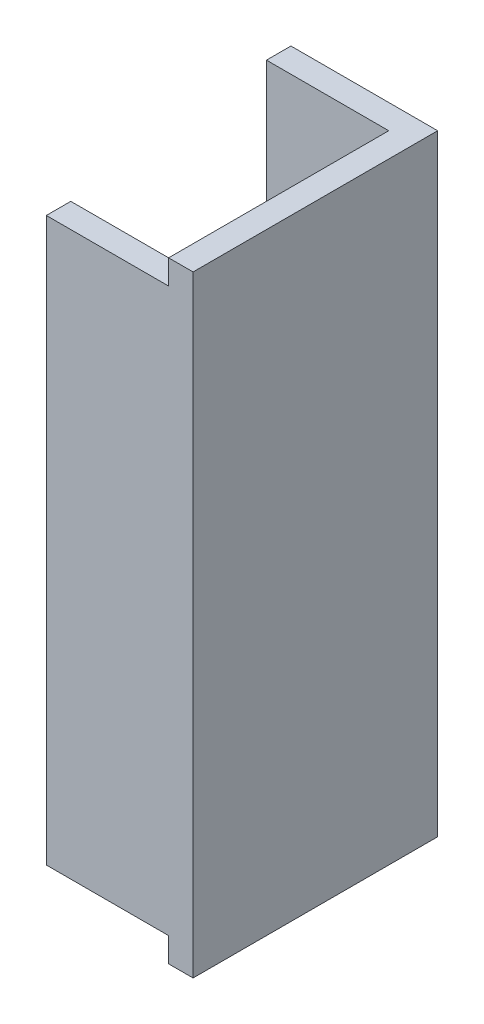
ISO-10303-21;
HEADER;
FILE_DESCRIPTION(('STEP AP214'),'2;1');
FILE_NAME('part.step','',(''),(''),'','','');
FILE_SCHEMA(('AUTOMOTIVE_DESIGN { 1 0 10303 214 1 1 1 1 }'));
ENDSEC;
DATA;
#1=APPLICATION_CONTEXT('core data for automotive mechanical design processes');
#2=APPLICATION_PROTOCOL_DEFINITION('international standard','automotive_design',2000,#1);
#3=PRODUCT_CONTEXT('',#1,'mechanical');
#4=PRODUCT('Part','Part','',(#3));
#5=PRODUCT_RELATED_PRODUCT_CATEGORY('part','',(#4));
#6=PRODUCT_DEFINITION_FORMATION('','',#4);
#7=PRODUCT_DEFINITION_CONTEXT('part definition',#1,'design');
#8=PRODUCT_DEFINITION('design','',#6,#7);
#9=PRODUCT_DEFINITION_SHAPE('','',#8);
#10=(LENGTH_UNIT() NAMED_UNIT(*) SI_UNIT(.MILLI.,.METRE.));
#11=(NAMED_UNIT(*) PLANE_ANGLE_UNIT() SI_UNIT($,.RADIAN.));
#12=(NAMED_UNIT(*) SI_UNIT($,.STERADIAN.) SOLID_ANGLE_UNIT());
#13=UNCERTAINTY_MEASURE_WITH_UNIT(LENGTH_MEASURE(1.E-05),#10,'distance_accuracy_value','');
#14=(GEOMETRIC_REPRESENTATION_CONTEXT(3) GLOBAL_UNCERTAINTY_ASSIGNED_CONTEXT((#13)) GLOBAL_UNIT_ASSIGNED_CONTEXT((#10,
#11,#12)) REPRESENTATION_CONTEXT('',''));
#15=CARTESIAN_POINT('',(0.,0.,0.));
#16=DIRECTION('',(0.,0.,1.));
#17=DIRECTION('',(1.,0.,0.));
#18=AXIS2_PLACEMENT_3D('',#15,#16,#17);
#19=CARTESIAN_POINT('',(0.95,-0.625,0.45));
#20=DIRECTION('',(0.,0.,1.));
#21=DIRECTION('',(1.,0.,0.));
#22=AXIS2_PLACEMENT_3D('',#19,#20,#21);
#23=PLANE('',#22);
#24=DIRECTION('',(0.,1.,0.));
#25=VECTOR('',#24,1.);
#26=CARTESIAN_POINT('',(0.95,-0.625,0.45));
#27=LINE('',#26,#25);
#28=CARTESIAN_POINT('',(0.95,0.575,0.45));
#29=VERTEX_POINT('',#28);
#30=CARTESIAN_POINT('',(0.95,-0.575,0.45));
#31=VERTEX_POINT('',#30);
#32=EDGE_CURVE('E117',#29,#31,#27,.F.);
#33=ORIENTED_EDGE('',*,*,#32,.T.);
#34=DIRECTION('',(1.,0.,0.));
#35=VECTOR('',#34,1.);
#36=CARTESIAN_POINT('',(0.7,-0.575,0.45));
#37=LINE('',#36,#35);
#38=CARTESIAN_POINT('',(0.7,-0.575,0.45));
#39=VERTEX_POINT('',#38);
#40=EDGE_CURVE('E92',#31,#39,#37,.F.);
#41=ORIENTED_EDGE('',*,*,#40,.T.);
#42=DIRECTION('',(0.,1.,0.));
#43=VECTOR('',#42,1.);
#44=CARTESIAN_POINT('',(0.7,-0.625,0.45));
#45=LINE('',#44,#43);
#46=CARTESIAN_POINT('',(0.7,0.575,0.45));
#47=VERTEX_POINT('',#46);
#48=EDGE_CURVE('E104',#47,#39,#45,.F.);
#49=ORIENTED_EDGE('',*,*,#48,.F.);
#50=DIRECTION('',(1.,0.,0.));
#51=VECTOR('',#50,1.);
#52=CARTESIAN_POINT('',(0.7,0.575,0.45));
#53=LINE('',#52,#51);
#54=EDGE_CURVE('E20',#47,#29,#53,.T.);
#55=ORIENTED_EDGE('',*,*,#54,.T.);
#56=EDGE_LOOP('',(#33,#41,#49,#55));
#57=FACE_BOUND('',#56,.T.);
#58=ADVANCED_FACE('F17',(#57),#23,.F.);
#59=CARTESIAN_POINT('',(0.7,0.575,0.45));
#60=DIRECTION('',(0.,-1.,0.));
#61=DIRECTION('',(0.,0.,-1.));
#62=AXIS2_PLACEMENT_3D('',#59,#60,#61);
#63=PLANE('',#62);
#64=ORIENTED_EDGE('',*,*,#54,.F.);
#65=DIRECTION('',(0.,0.,1.));
#66=VECTOR('',#65,1.);
#67=CARTESIAN_POINT('',(0.7,0.575,0.45));
#68=LINE('',#67,#66);
#69=CARTESIAN_POINT('',(0.7,0.575,0.5));
#70=VERTEX_POINT('',#69);
#71=EDGE_CURVE('E100',#70,#47,#68,.F.);
#72=ORIENTED_EDGE('',*,*,#71,.F.);
#73=DIRECTION('',(1.,0.,0.));
#74=VECTOR('',#73,1.);
#75=CARTESIAN_POINT('',(0.95,0.575,0.5));
#76=LINE('',#75,#74);
#77=CARTESIAN_POINT('',(0.95,0.575,0.5));
#78=VERTEX_POINT('',#77);
#79=EDGE_CURVE('E128',#78,#70,#76,.F.);
#80=ORIENTED_EDGE('',*,*,#79,.F.);
#81=DIRECTION('',(0.,0.,-1.));
#82=VECTOR('',#81,1.);
#83=CARTESIAN_POINT('',(0.95,0.575,0.05));
#84=LINE('',#83,#82);
#85=EDGE_CURVE('E102',#78,#29,#84,.T.);
#86=ORIENTED_EDGE('',*,*,#85,.T.);
#87=EDGE_LOOP('',(#64,#72,#80,#86));
#88=FACE_BOUND('',#87,.T.);
#89=ADVANCED_FACE('F97',(#88),#63,.F.);
#90=CARTESIAN_POINT('',(0.7,-0.625,0.45));
#91=DIRECTION('',(-1.,0.,0.));
#92=DIRECTION('',(0.,0.,1.));
#93=AXIS2_PLACEMENT_3D('',#90,#91,#92);
#94=PLANE('',#93);
#95=ORIENTED_EDGE('',*,*,#48,.T.);
#96=DIRECTION('',(0.,0.,1.));
#97=VECTOR('',#96,1.);
#98=CARTESIAN_POINT('',(0.7,-0.575,0.45));
#99=LINE('',#98,#97);
#100=CARTESIAN_POINT('',(0.7,-0.575,0.5));
#101=VERTEX_POINT('',#100);
#102=EDGE_CURVE('E114',#39,#101,#99,.T.);
#103=ORIENTED_EDGE('',*,*,#102,.T.);
#104=DIRECTION('',(0.,1.,0.));
#105=VECTOR('',#104,1.);
#106=CARTESIAN_POINT('',(0.7,-0.625,0.5));
#107=LINE('',#106,#105);
#108=EDGE_CURVE('E110',#70,#101,#107,.F.);
#109=ORIENTED_EDGE('',*,*,#108,.F.);
#110=ORIENTED_EDGE('',*,*,#71,.T.);
#111=EDGE_LOOP('',(#95,#103,#109,#110));
#112=FACE_BOUND('',#111,.T.);
#113=ADVANCED_FACE('F108',(#112),#94,.T.);
#114=CARTESIAN_POINT('',(0.7,-0.575,0.45));
#115=DIRECTION('',(0.,1.,0.));
#116=DIRECTION('',(0.,0.,1.));
#117=AXIS2_PLACEMENT_3D('',#114,#115,#116);
#118=PLANE('',#117);
#119=ORIENTED_EDGE('',*,*,#40,.F.);
#120=DIRECTION('',(0.,0.,-1.));
#121=VECTOR('',#120,1.);
#122=CARTESIAN_POINT('',(0.95,-0.575,0.05));
#123=LINE('',#122,#121);
#124=CARTESIAN_POINT('',(0.95,-0.575,0.5));
#125=VERTEX_POINT('',#124);
#126=EDGE_CURVE('E119',#31,#125,#123,.F.);
#127=ORIENTED_EDGE('',*,*,#126,.T.);
#128=DIRECTION('',(1.,0.,0.));
#129=VECTOR('',#128,1.);
#130=CARTESIAN_POINT('',(0.95,-0.575,0.5));
#131=LINE('',#130,#129);
#132=EDGE_CURVE('E131',#101,#125,#131,.T.);
#133=ORIENTED_EDGE('',*,*,#132,.F.);
#134=ORIENTED_EDGE('',*,*,#102,.F.);
#135=EDGE_LOOP('',(#119,#127,#133,#134));
#136=FACE_BOUND('',#135,.T.);
#137=ADVANCED_FACE('F205',(#136),#118,.F.);
#138=CARTESIAN_POINT('',(0.95,-0.625,0.05));
#139=DIRECTION('',(1.,0.,0.));
#140=DIRECTION('',(0.,0.,-1.));
#141=AXIS2_PLACEMENT_3D('',#138,#139,#140);
#142=PLANE('',#141);
#143=DIRECTION('',(0.,0.,-1.));
#144=VECTOR('',#143,1.);
#145=CARTESIAN_POINT('',(0.95,-0.625,0.45));
#146=LINE('',#145,#144);
#147=CARTESIAN_POINT('',(0.95,-0.625,0.5));
#148=VERTEX_POINT('',#147);
#149=CARTESIAN_POINT('',(0.95,-0.625,0.05));
#150=VERTEX_POINT('',#149);
#151=EDGE_CURVE('E144',#148,#150,#146,.T.);
#152=ORIENTED_EDGE('',*,*,#151,.F.);
#153=DIRECTION('',(0.,1.,0.));
#154=VECTOR('',#153,1.);
#155=CARTESIAN_POINT('',(0.95,-0.625,0.5));
#156=LINE('',#155,#154);
#157=EDGE_CURVE('E134',#125,#148,#156,.F.);
#158=ORIENTED_EDGE('',*,*,#157,.F.);
#159=ORIENTED_EDGE('',*,*,#126,.F.);
#160=ORIENTED_EDGE('',*,*,#32,.F.);
#161=ORIENTED_EDGE('',*,*,#85,.F.);
#162=DIRECTION('',(0.,1.,0.));
#163=VECTOR('',#162,1.);
#164=CARTESIAN_POINT('',(0.95,-0.625,0.5));
#165=LINE('',#164,#163);
#166=CARTESIAN_POINT('',(0.95,0.625,0.5));
#167=VERTEX_POINT('',#166);
#168=EDGE_CURVE('E125',#167,#78,#165,.F.);
#169=ORIENTED_EDGE('',*,*,#168,.F.);
#170=DIRECTION('',(0.,0.,-1.));
#171=VECTOR('',#170,1.);
#172=CARTESIAN_POINT('',(0.95,0.625,0.05));
#173=LINE('',#172,#171);
#174=CARTESIAN_POINT('',(0.95,0.625,0.05));
#175=VERTEX_POINT('',#174);
#176=EDGE_CURVE('E155',#167,#175,#173,.T.);
#177=ORIENTED_EDGE('',*,*,#176,.T.);
#178=DIRECTION('',(0.,1.,0.));
#179=VECTOR('',#178,1.);
#180=CARTESIAN_POINT('',(0.95,-0.625,0.05));
#181=LINE('',#180,#179);
#182=EDGE_CURVE('E121',#175,#150,#181,.F.);
#183=ORIENTED_EDGE('',*,*,#182,.T.);
#184=EDGE_LOOP('',(#152,#158,#159,#160,#161,#169,#177,#183));
#185=FACE_BOUND('',#184,.T.);
#186=ADVANCED_FACE('F192',(#185),#142,.F.);
#187=CARTESIAN_POINT('',(0.7,-0.625,0.05));
#188=DIRECTION('',(0.,0.,-1.));
#189=DIRECTION('',(-1.,0.,0.));
#190=AXIS2_PLACEMENT_3D('',#187,#188,#189);
#191=PLANE('',#190);
#192=DIRECTION('',(1.,0.,0.));
#193=VECTOR('',#192,1.);
#194=CARTESIAN_POINT('',(0.95,-0.625,0.05));
#195=LINE('',#194,#193);
#196=CARTESIAN_POINT('',(0.7,-0.625,0.05));
#197=VERTEX_POINT('',#196);
#198=EDGE_CURVE('E136',#150,#197,#195,.F.);
#199=ORIENTED_EDGE('',*,*,#198,.F.);
#200=ORIENTED_EDGE('',*,*,#182,.F.);
#201=DIRECTION('',(1.,0.,0.));
#202=VECTOR('',#201,1.);
#203=CARTESIAN_POINT('',(0.95,0.625,0.05));
#204=LINE('',#203,#202);
#205=CARTESIAN_POINT('',(0.7,0.625,0.05));
#206=VERTEX_POINT('',#205);
#207=EDGE_CURVE('E157',#175,#206,#204,.F.);
#208=ORIENTED_EDGE('',*,*,#207,.T.);
#209=DIRECTION('',(0.,1.,0.));
#210=VECTOR('',#209,1.);
#211=CARTESIAN_POINT('',(0.7,-0.625,0.05));
#212=LINE('',#211,#210);
#213=EDGE_CURVE('E123',#206,#197,#212,.F.);
#214=ORIENTED_EDGE('',*,*,#213,.T.);
#215=EDGE_LOOP('',(#199,#200,#208,#214));
#216=FACE_BOUND('',#215,.T.);
#217=ADVANCED_FACE('F196',(#216),#191,.F.);
#218=CARTESIAN_POINT('',(0.7,-0.625,0.05));
#219=DIRECTION('',(1.,0.,0.));
#220=DIRECTION('',(0.,0.,-1.));
#221=AXIS2_PLACEMENT_3D('',#218,#219,#220);
#222=PLANE('',#221);
#223=DIRECTION('',(0.,0.,-1.));
#224=VECTOR('',#223,1.);
#225=CARTESIAN_POINT('',(0.7,-0.625,0.45));
#226=LINE('',#225,#224);
#227=CARTESIAN_POINT('',(0.7,-0.625,0.));
#228=VERTEX_POINT('',#227);
#229=EDGE_CURVE('E139',#197,#228,#226,.T.);
#230=ORIENTED_EDGE('',*,*,#229,.F.);
#231=ORIENTED_EDGE('',*,*,#213,.F.);
#232=DIRECTION('',(0.,0.,-1.));
#233=VECTOR('',#232,1.);
#234=CARTESIAN_POINT('',(0.7,0.625,0.05));
#235=LINE('',#234,#233);
#236=CARTESIAN_POINT('',(0.7,0.625,0.));
#237=VERTEX_POINT('',#236);
#238=EDGE_CURVE('E159',#206,#237,#235,.T.);
#239=ORIENTED_EDGE('',*,*,#238,.T.);
#240=DIRECTION('',(0.,1.,0.));
#241=VECTOR('',#240,1.);
#242=CARTESIAN_POINT('',(0.7,-0.625,0.));
#243=LINE('',#242,#241);
#244=EDGE_CURVE('E150',#228,#237,#243,.T.);
#245=ORIENTED_EDGE('',*,*,#244,.F.);
#246=EDGE_LOOP('',(#230,#231,#239,#245));
#247=FACE_BOUND('',#246,.T.);
#248=ADVANCED_FACE('F180',(#247),#222,.F.);
#249=CARTESIAN_POINT('',(0.95,-0.625,0.5));
#250=DIRECTION('',(0.,0.,1.));
#251=DIRECTION('',(1.,0.,0.));
#252=AXIS2_PLACEMENT_3D('',#249,#250,#251);
#253=PLANE('',#252);
#254=ORIENTED_EDGE('',*,*,#132,.T.);
#255=ORIENTED_EDGE('',*,*,#157,.T.);
#256=DIRECTION('',(1.,0.,0.));
#257=VECTOR('',#256,1.);
#258=CARTESIAN_POINT('',(0.95,-0.625,0.5));
#259=LINE('',#258,#257);
#260=CARTESIAN_POINT('',(1.,-0.625,0.5));
#261=VERTEX_POINT('',#260);
#262=EDGE_CURVE('E141',#261,#148,#259,.F.);
#263=ORIENTED_EDGE('',*,*,#262,.F.);
#264=DIRECTION('',(0.,1.,0.));
#265=VECTOR('',#264,1.);
#266=CARTESIAN_POINT('',(1.,-0.625,0.5));
#267=LINE('',#266,#265);
#268=CARTESIAN_POINT('',(1.,0.625,0.5));
#269=VERTEX_POINT('',#268);
#270=EDGE_CURVE('E162',#269,#261,#267,.F.);
#271=ORIENTED_EDGE('',*,*,#270,.F.);
#272=DIRECTION('',(1.,0.,0.));
#273=VECTOR('',#272,1.);
#274=CARTESIAN_POINT('',(0.95,0.625,0.5));
#275=LINE('',#274,#273);
#276=EDGE_CURVE('E152',#269,#167,#275,.F.);
#277=ORIENTED_EDGE('',*,*,#276,.T.);
#278=ORIENTED_EDGE('',*,*,#168,.T.);
#279=ORIENTED_EDGE('',*,*,#79,.T.);
#280=ORIENTED_EDGE('',*,*,#108,.T.);
#281=EDGE_LOOP('',(#254,#255,#263,#271,#277,#278,#279,#280));
#282=FACE_BOUND('',#281,.T.);
#283=ADVANCED_FACE('F188',(#282),#253,.T.);
#284=CARTESIAN_POINT('',(0.95,-0.625,0.45));
#285=DIRECTION('',(0.,-1.,0.));
#286=DIRECTION('',(0.,0.,-1.));
#287=AXIS2_PLACEMENT_3D('',#284,#285,#286);
#288=PLANE('',#287);
#289=ORIENTED_EDGE('',*,*,#262,.T.);
#290=ORIENTED_EDGE('',*,*,#151,.T.);
#291=ORIENTED_EDGE('',*,*,#198,.T.);
#292=ORIENTED_EDGE('',*,*,#229,.T.);
#293=DIRECTION('',(-1.,0.,0.));
#294=VECTOR('',#293,1.);
#295=CARTESIAN_POINT('',(0.7,-0.625,0.));
#296=LINE('',#295,#294);
#297=CARTESIAN_POINT('',(1.,-0.625,0.));
#298=VERTEX_POINT('',#297);
#299=EDGE_CURVE('E147',#298,#228,#296,.T.);
#300=ORIENTED_EDGE('',*,*,#299,.F.);
#301=DIRECTION('',(0.,0.,-1.));
#302=VECTOR('',#301,1.);
#303=CARTESIAN_POINT('',(1.,-0.625,0.05));
#304=LINE('',#303,#302);
#305=EDGE_CURVE('E165',#261,#298,#304,.T.);
#306=ORIENTED_EDGE('',*,*,#305,.F.);
#307=EDGE_LOOP('',(#289,#290,#291,#292,#300,#306));
#308=FACE_BOUND('',#307,.T.);
#309=ADVANCED_FACE('F175',(#308),#288,.T.);
#310=CARTESIAN_POINT('',(0.7,-0.625,0.));
#311=DIRECTION('',(0.,0.,-1.));
#312=DIRECTION('',(-1.,0.,0.));
#313=AXIS2_PLACEMENT_3D('',#310,#311,#312);
#314=PLANE('',#313);
#315=ORIENTED_EDGE('',*,*,#244,.T.);
#316=DIRECTION('',(1.,0.,0.));
#317=VECTOR('',#316,1.);
#318=CARTESIAN_POINT('',(0.95,0.625,0.));
#319=LINE('',#318,#317);
#320=CARTESIAN_POINT('',(1.,0.625,0.));
#321=VERTEX_POINT('',#320);
#322=EDGE_CURVE('E35',#237,#321,#319,.T.);
#323=ORIENTED_EDGE('',*,*,#322,.T.);
#324=DIRECTION('',(0.,1.,0.));
#325=VECTOR('',#324,1.);
#326=CARTESIAN_POINT('',(1.,-0.625,0.));
#327=LINE('',#326,#325);
#328=EDGE_CURVE('E26',#298,#321,#327,.T.);
#329=ORIENTED_EDGE('',*,*,#328,.F.);
#330=ORIENTED_EDGE('',*,*,#299,.T.);
#331=EDGE_LOOP('',(#315,#323,#329,#330));
#332=FACE_BOUND('',#331,.T.);
#333=ADVANCED_FACE('F172',(#332),#314,.T.);
#334=CARTESIAN_POINT('',(0.95,0.625,0.05));
#335=DIRECTION('',(0.,-1.,0.));
#336=DIRECTION('',(0.,0.,-1.));
#337=AXIS2_PLACEMENT_3D('',#334,#335,#336);
#338=PLANE('',#337);
#339=ORIENTED_EDGE('',*,*,#322,.F.);
#340=ORIENTED_EDGE('',*,*,#238,.F.);
#341=ORIENTED_EDGE('',*,*,#207,.F.);
#342=ORIENTED_EDGE('',*,*,#176,.F.);
#343=ORIENTED_EDGE('',*,*,#276,.F.);
#344=DIRECTION('',(0.,0.,-1.));
#345=VECTOR('',#344,1.);
#346=CARTESIAN_POINT('',(1.,0.625,0.05));
#347=LINE('',#346,#345);
#348=EDGE_CURVE('E11',#321,#269,#347,.F.);
#349=ORIENTED_EDGE('',*,*,#348,.F.);
#350=EDGE_LOOP('',(#339,#340,#341,#342,#343,#349));
#351=FACE_BOUND('',#350,.T.);
#352=ADVANCED_FACE('F184',(#351),#338,.F.);
#353=CARTESIAN_POINT('',(1.,-0.625,0.05));
#354=DIRECTION('',(1.,0.,0.));
#355=DIRECTION('',(0.,0.,-1.));
#356=AXIS2_PLACEMENT_3D('',#353,#354,#355);
#357=PLANE('',#356);
#358=ORIENTED_EDGE('',*,*,#328,.T.);
#359=ORIENTED_EDGE('',*,*,#348,.T.);
#360=ORIENTED_EDGE('',*,*,#270,.T.);
#361=ORIENTED_EDGE('',*,*,#305,.T.);
#362=EDGE_LOOP('',(#358,#359,#360,#361));
#363=FACE_BOUND('',#362,.T.);
#364=ADVANCED_FACE('F170',(#363),#357,.T.);
#365=CLOSED_SHELL('',(#58,#89,#113,#137,#186,#217,#248,#283,#309,#333,#352,#364));
#366=MANIFOLD_SOLID_BREP('B1',#365);
#367=ADVANCED_BREP_SHAPE_REPRESENTATION('',(#18,#366),#14);
#368=SHAPE_DEFINITION_REPRESENTATION(#9,#367);
ENDSEC;
END-ISO-10303-21;
